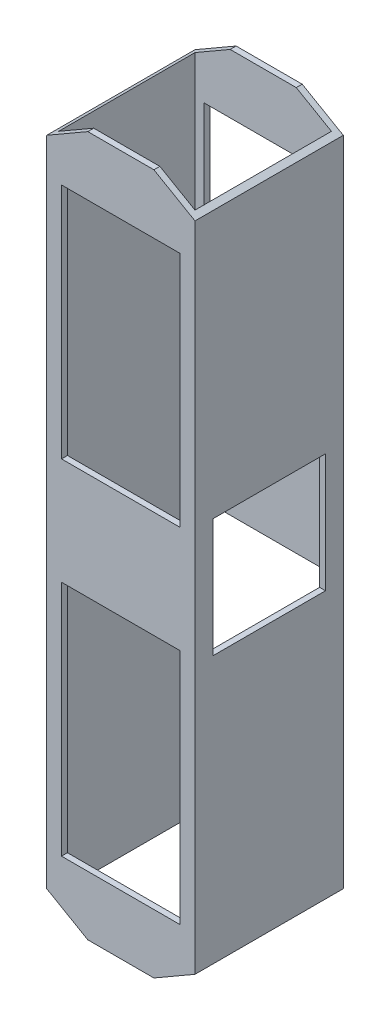
ISO-10303-21;
HEADER;
FILE_DESCRIPTION(('STEP AP214'),'2;1');
FILE_NAME('part.step','',(''),(''),'','','');
FILE_SCHEMA(('AUTOMOTIVE_DESIGN { 1 0 10303 214 1 1 1 1 }'));
ENDSEC;
DATA;
#1=APPLICATION_CONTEXT('core data for automotive mechanical design processes');
#2=APPLICATION_PROTOCOL_DEFINITION('international standard','automotive_design',2000,#1);
#3=PRODUCT_CONTEXT('',#1,'mechanical');
#4=PRODUCT('Part','Part','',(#3));
#5=PRODUCT_RELATED_PRODUCT_CATEGORY('part','',(#4));
#6=PRODUCT_DEFINITION_FORMATION('','',#4);
#7=PRODUCT_DEFINITION_CONTEXT('part definition',#1,'design');
#8=PRODUCT_DEFINITION('design','',#6,#7);
#9=PRODUCT_DEFINITION_SHAPE('','',#8);
#10=(LENGTH_UNIT() NAMED_UNIT(*) SI_UNIT(.MILLI.,.METRE.));
#11=(NAMED_UNIT(*) PLANE_ANGLE_UNIT() SI_UNIT($,.RADIAN.));
#12=(NAMED_UNIT(*) SI_UNIT($,.STERADIAN.) SOLID_ANGLE_UNIT());
#13=UNCERTAINTY_MEASURE_WITH_UNIT(LENGTH_MEASURE(1.E-05),#10,'distance_accuracy_value','');
#14=(GEOMETRIC_REPRESENTATION_CONTEXT(3) GLOBAL_UNCERTAINTY_ASSIGNED_CONTEXT((#13)) GLOBAL_UNIT_ASSIGNED_CONTEXT((#10,
#11,#12)) REPRESENTATION_CONTEXT('',''));
#15=CARTESIAN_POINT('',(0.,0.,0.));
#16=DIRECTION('',(0.,0.,1.));
#17=DIRECTION('',(1.,0.,0.));
#18=AXIS2_PLACEMENT_3D('',#15,#16,#17);
#19=CARTESIAN_POINT('',(-35.0558988321171,-98.8768142031625,25.));
#20=DIRECTION('',(0.,1.,0.));
#21=DIRECTION('',(0.,0.,1.));
#22=AXIS2_PLACEMENT_3D('',#19,#20,#21);
#23=PLANE('',#22);
#24=DIRECTION('',(1.,0.,0.));
#25=VECTOR('',#24,1.);
#26=CARTESIAN_POINT('',(-35.0558988321171,-98.8768142031625,0.));
#27=LINE('',#26,#25);
#28=CARTESIAN_POINT('',(-28.1276956018415,-98.8768142031625,0.));
#29=VERTEX_POINT('',#28);
#30=CARTESIAN_POINT('',(-16.9841020623928,-98.8768142031625,0.));
#31=VERTEX_POINT('',#30);
#32=EDGE_CURVE('E437',#29,#31,#27,.T.);
#33=ORIENTED_EDGE('',*,*,#32,.T.);
#34=DIRECTION('',(0.,0.,1.));
#35=VECTOR('',#34,1.);
#36=CARTESIAN_POINT('',(-16.9841020623928,-98.8768142031625,25.));
#37=LINE('',#36,#35);
#38=CARTESIAN_POINT('',(-16.9841020623927,-98.8768142031625,1.));
#39=VERTEX_POINT('',#38);
#40=EDGE_CURVE('E523',#31,#39,#37,.T.);
#41=ORIENTED_EDGE('',*,*,#40,.T.);
#42=DIRECTION('',(1.,0.,0.));
#43=VECTOR('',#42,1.);
#44=CARTESIAN_POINT('',(-35.0558988321171,-98.8768142031625,1.));
#45=LINE('',#44,#43);
#46=CARTESIAN_POINT('',(-28.1276956018414,-98.8768142031625,1.));
#47=VERTEX_POINT('',#46);
#48=EDGE_CURVE('E418',#47,#39,#45,.T.);
#49=ORIENTED_EDGE('',*,*,#48,.F.);
#50=DIRECTION('',(0.,0.,-1.));
#51=VECTOR('',#50,1.);
#52=CARTESIAN_POINT('',(-28.1276956018414,-98.8768142031625,25.));
#53=LINE('',#52,#51);
#54=EDGE_CURVE('E516',#47,#29,#53,.T.);
#55=ORIENTED_EDGE('',*,*,#54,.T.);
#56=EDGE_LOOP('',(#33,#41,#49,#55));
#57=FACE_BOUND('',#56,.T.);
#58=ADVANCED_FACE('F35',(#57),#23,.F.);
#59=CARTESIAN_POINT('',(-35.0558988321171,19.1231857968375,25.));
#60=DIRECTION('',(0.,-1.,0.));
#61=DIRECTION('',(0.,0.,-1.));
#62=AXIS2_PLACEMENT_3D('',#59,#60,#61);
#63=PLANE('',#62);
#64=DIRECTION('',(-1.,0.,0.));
#65=VECTOR('',#64,1.);
#66=CARTESIAN_POINT('',(-35.0558988321171,19.1231857968375,0.));
#67=LINE('',#66,#65);
#68=CARTESIAN_POINT('',(-16.9841020623928,19.1231857968375,0.));
#69=VERTEX_POINT('',#68);
#70=CARTESIAN_POINT('',(-28.1276956018415,19.1231857968375,0.));
#71=VERTEX_POINT('',#70);
#72=EDGE_CURVE('E447',#69,#71,#67,.T.);
#73=ORIENTED_EDGE('',*,*,#72,.T.);
#74=DIRECTION('',(0.,0.,1.));
#75=VECTOR('',#74,1.);
#76=CARTESIAN_POINT('',(-28.1276956018415,19.1231857968375,25.));
#77=LINE('',#76,#75);
#78=CARTESIAN_POINT('',(-28.1276956018415,19.1231857968375,1.));
#79=VERTEX_POINT('',#78);
#80=EDGE_CURVE('E486',#71,#79,#77,.T.);
#81=ORIENTED_EDGE('',*,*,#80,.T.);
#82=DIRECTION('',(-1.,0.,0.));
#83=VECTOR('',#82,1.);
#84=CARTESIAN_POINT('',(-35.0558988321171,19.1231857968375,1.));
#85=LINE('',#84,#83);
#86=CARTESIAN_POINT('',(-16.9841020623928,19.1231857968375,1.));
#87=VERTEX_POINT('',#86);
#88=EDGE_CURVE('E414',#87,#79,#85,.T.);
#89=ORIENTED_EDGE('',*,*,#88,.F.);
#90=DIRECTION('',(0.,0.,-1.));
#91=VECTOR('',#90,1.);
#92=CARTESIAN_POINT('',(-16.9841020623928,19.1231857968375,25.));
#93=LINE('',#92,#91);
#94=EDGE_CURVE('E479',#87,#69,#93,.T.);
#95=ORIENTED_EDGE('',*,*,#94,.T.);
#96=EDGE_LOOP('',(#73,#81,#89,#95));
#97=FACE_BOUND('',#96,.T.);
#98=ADVANCED_FACE('F588',(#97),#63,.F.);
#99=DIRECTION('',(-1.,0.,0.));
#100=VECTOR('',#99,1.);
#101=CARTESIAN_POINT('',(-35.0558988321171,19.1231857968375,24.));
#102=LINE('',#101,#100);
#103=CARTESIAN_POINT('',(-16.9841020623928,19.1231857968375,24.));
#104=VERTEX_POINT('',#103);
#105=CARTESIAN_POINT('',(-28.1276956018415,19.1231857968375,24.));
#106=VERTEX_POINT('',#105);
#107=EDGE_CURVE('E417',#104,#106,#102,.T.);
#108=ORIENTED_EDGE('',*,*,#107,.T.);
#109=DIRECTION('',(0.,0.,1.));
#110=VECTOR('',#109,1.);
#111=CARTESIAN_POINT('',(-28.1276956018415,19.1231857968375,25.));
#112=LINE('',#111,#110);
#113=CARTESIAN_POINT('',(-28.1276956018415,19.1231857968375,25.));
#114=VERTEX_POINT('',#113);
#115=EDGE_CURVE('E484',#106,#114,#112,.T.);
#116=ORIENTED_EDGE('',*,*,#115,.T.);
#117=DIRECTION('',(-1.,0.,0.));
#118=VECTOR('',#117,1.);
#119=CARTESIAN_POINT('',(-35.0558988321171,19.1231857968375,25.));
#120=LINE('',#119,#118);
#121=CARTESIAN_POINT('',(-16.9841020623928,19.1231857968375,25.));
#122=VERTEX_POINT('',#121);
#123=EDGE_CURVE('E436',#122,#114,#120,.T.);
#124=ORIENTED_EDGE('',*,*,#123,.F.);
#125=DIRECTION('',(0.,0.,-1.));
#126=VECTOR('',#125,1.);
#127=CARTESIAN_POINT('',(-16.9841020623928,19.1231857968375,25.));
#128=LINE('',#127,#126);
#129=EDGE_CURVE('E481',#122,#104,#128,.T.);
#130=ORIENTED_EDGE('',*,*,#129,.T.);
#131=EDGE_LOOP('',(#108,#116,#124,#130));
#132=FACE_BOUND('',#131,.T.);
#133=ADVANCED_FACE('F599',(#132),#63,.F.);
#134=DIRECTION('',(1.,0.,0.));
#135=VECTOR('',#134,1.);
#136=CARTESIAN_POINT('',(-35.0558988321171,-98.8768142031625,24.));
#137=LINE('',#136,#135);
#138=CARTESIAN_POINT('',(-28.1276956018415,-98.8768142031625,24.));
#139=VERTEX_POINT('',#138);
#140=CARTESIAN_POINT('',(-16.9841020623928,-98.8768142031625,24.));
#141=VERTEX_POINT('',#140);
#142=EDGE_CURVE('E421',#139,#141,#137,.T.);
#143=ORIENTED_EDGE('',*,*,#142,.T.);
#144=DIRECTION('',(0.,0.,1.));
#145=VECTOR('',#144,1.);
#146=CARTESIAN_POINT('',(-16.9841020623928,-98.8768142031625,25.));
#147=LINE('',#146,#145);
#148=CARTESIAN_POINT('',(-16.9841020623928,-98.8768142031625,25.));
#149=VERTEX_POINT('',#148);
#150=EDGE_CURVE('E521',#141,#149,#147,.T.);
#151=ORIENTED_EDGE('',*,*,#150,.T.);
#152=DIRECTION('',(1.,0.,0.));
#153=VECTOR('',#152,1.);
#154=CARTESIAN_POINT('',(-35.0558988321171,-98.8768142031625,25.));
#155=LINE('',#154,#153);
#156=CARTESIAN_POINT('',(-28.1276956018414,-98.8768142031625,25.));
#157=VERTEX_POINT('',#156);
#158=EDGE_CURVE('E442',#157,#149,#155,.T.);
#159=ORIENTED_EDGE('',*,*,#158,.F.);
#160=DIRECTION('',(0.,0.,-1.));
#161=VECTOR('',#160,1.);
#162=CARTESIAN_POINT('',(-28.1276956018414,-98.8768142031625,25.));
#163=LINE('',#162,#161);
#164=EDGE_CURVE('E518',#157,#139,#163,.T.);
#165=ORIENTED_EDGE('',*,*,#164,.T.);
#166=EDGE_LOOP('',(#143,#151,#159,#165));
#167=FACE_BOUND('',#166,.T.);
#168=ADVANCED_FACE('F576',(#167),#23,.F.);
#169=CARTESIAN_POINT('',(-10.0558988321171,19.1231857968375,25.));
#170=DIRECTION('',(-1.,0.,0.));
#171=DIRECTION('',(0.,-1.,0.));
#172=AXIS2_PLACEMENT_3D('',#169,#170,#171);
#173=PLANE('',#172);
#174=DIRECTION('',(0.,1.,0.));
#175=VECTOR('',#174,1.);
#176=CARTESIAN_POINT('',(-10.0558988321171,-29.8768142031625,3.));
#177=LINE('',#176,#175);
#178=CARTESIAN_POINT('',(-10.0558988321171,-49.8768142031625,3.));
#179=VERTEX_POINT('',#178);
#180=CARTESIAN_POINT('',(-10.0558988321171,-29.8768142031625,3.));
#181=VERTEX_POINT('',#180);
#182=EDGE_CURVE('E303',#179,#181,#177,.T.);
#183=ORIENTED_EDGE('',*,*,#182,.F.);
#184=DIRECTION('',(0.,0.,-1.));
#185=VECTOR('',#184,1.);
#186=CARTESIAN_POINT('',(-10.0558988321171,-49.8768142031625,3.));
#187=LINE('',#186,#185);
#188=CARTESIAN_POINT('',(-10.0558988321171,-49.8768142031625,22.));
#189=VERTEX_POINT('',#188);
#190=EDGE_CURVE('E276',#189,#179,#187,.T.);
#191=ORIENTED_EDGE('',*,*,#190,.F.);
#192=DIRECTION('',(0.,-1.,0.));
#193=VECTOR('',#192,1.);
#194=CARTESIAN_POINT('',(-10.0558988321171,-29.8768142031625,22.));
#195=LINE('',#194,#193);
#196=CARTESIAN_POINT('',(-10.0558988321171,-29.8768142031625,22.));
#197=VERTEX_POINT('',#196);
#198=EDGE_CURVE('E294',#197,#189,#195,.T.);
#199=ORIENTED_EDGE('',*,*,#198,.F.);
#200=DIRECTION('',(0.,0.,1.));
#201=VECTOR('',#200,1.);
#202=CARTESIAN_POINT('',(-10.0558988321171,-29.8768142031625,3.));
#203=LINE('',#202,#201);
#204=EDGE_CURVE('E297',#181,#197,#203,.T.);
#205=ORIENTED_EDGE('',*,*,#204,.F.);
#206=EDGE_LOOP('',(#183,#191,#199,#205));
#207=FACE_BOUND('',#206,.T.);
#208=DIRECTION('',(0.,1.,0.));
#209=VECTOR('',#208,1.);
#210=CARTESIAN_POINT('',(-10.0558988321171,19.1231857968375,25.));
#211=LINE('',#210,#209);
#212=CARTESIAN_POINT('',(-10.0558988321171,-94.8768142031624,25.));
#213=VERTEX_POINT('',#212);
#214=CARTESIAN_POINT('',(-10.0558988321171,15.1231857968374,25.));
#215=VERTEX_POINT('',#214);
#216=EDGE_CURVE('E434',#213,#215,#211,.T.);
#217=ORIENTED_EDGE('',*,*,#216,.F.);
#218=DIRECTION('',(0.,0.,-1.));
#219=VECTOR('',#218,1.);
#220=CARTESIAN_POINT('',(-10.0558988321171,-94.8768142031625,25.));
#221=LINE('',#220,#219);
#222=CARTESIAN_POINT('',(-10.0558988321171,-94.8768142031625,0.));
#223=VERTEX_POINT('',#222);
#224=EDGE_CURVE('E509',#213,#223,#221,.T.);
#225=ORIENTED_EDGE('',*,*,#224,.T.);
#226=DIRECTION('',(0.,1.,0.));
#227=VECTOR('',#226,1.);
#228=CARTESIAN_POINT('',(-10.0558988321171,19.1231857968375,0.));
#229=LINE('',#228,#227);
#230=CARTESIAN_POINT('',(-10.0558988321171,15.1231857968374,0.));
#231=VERTEX_POINT('',#230);
#232=EDGE_CURVE('E431',#223,#231,#229,.T.);
#233=ORIENTED_EDGE('',*,*,#232,.T.);
#234=DIRECTION('',(0.,0.,1.));
#235=VECTOR('',#234,1.);
#236=CARTESIAN_POINT('',(-10.0558988321171,15.1231857968374,25.));
#237=LINE('',#236,#235);
#238=EDGE_CURVE('E506',#231,#215,#237,.T.);
#239=ORIENTED_EDGE('',*,*,#238,.T.);
#240=EDGE_LOOP('',(#217,#225,#233,#239));
#241=FACE_BOUND('',#240,.T.);
#242=ADVANCED_FACE('F565',(#207,#241),#173,.F.);
#243=CARTESIAN_POINT('',(-35.0558988321171,-98.8768142031625,25.));
#244=DIRECTION('',(1.,0.,0.));
#245=DIRECTION('',(0.,1.,0.));
#246=AXIS2_PLACEMENT_3D('',#243,#244,#245);
#247=PLANE('',#246);
#248=DIRECTION('',(0.,-1.,0.));
#249=VECTOR('',#248,1.);
#250=CARTESIAN_POINT('',(-35.0558988321171,-98.8768142031625,0.));
#251=LINE('',#250,#249);
#252=CARTESIAN_POINT('',(-35.0558988321171,15.1231857968374,0.));
#253=VERTEX_POINT('',#252);
#254=CARTESIAN_POINT('',(-35.0558988321171,-94.8768142031625,0.));
#255=VERTEX_POINT('',#254);
#256=EDGE_CURVE('E450',#253,#255,#251,.T.);
#257=ORIENTED_EDGE('',*,*,#256,.T.);
#258=DIRECTION('',(0.,0.,1.));
#259=VECTOR('',#258,1.);
#260=CARTESIAN_POINT('',(-35.0558988321171,-94.8768142031625,25.));
#261=LINE('',#260,#259);
#262=CARTESIAN_POINT('',(-35.0558988321171,-94.8768142031625,25.));
#263=VERTEX_POINT('',#262);
#264=EDGE_CURVE('E11',#255,#263,#261,.T.);
#265=ORIENTED_EDGE('',*,*,#264,.T.);
#266=DIRECTION('',(0.,-1.,0.));
#267=VECTOR('',#266,1.);
#268=CARTESIAN_POINT('',(-35.0558988321171,-98.8768142031625,25.));
#269=LINE('',#268,#267);
#270=CARTESIAN_POINT('',(-35.0558988321171,15.1231857968374,25.));
#271=VERTEX_POINT('',#270);
#272=EDGE_CURVE('E440',#271,#263,#269,.T.);
#273=ORIENTED_EDGE('',*,*,#272,.F.);
#274=DIRECTION('',(0.,0.,-1.));
#275=VECTOR('',#274,1.);
#276=CARTESIAN_POINT('',(-35.0558988321171,15.1231857968374,25.));
#277=LINE('',#276,#275);
#278=EDGE_CURVE('E471',#271,#253,#277,.T.);
#279=ORIENTED_EDGE('',*,*,#278,.T.);
#280=EDGE_LOOP('',(#257,#265,#273,#279));
#281=FACE_BOUND('',#280,.T.);
#282=ADVANCED_FACE('F602',(#281),#247,.F.);
#283=CARTESIAN_POINT('',(0.,0.,25.));
#284=DIRECTION('',(0.,0.,1.));
#285=DIRECTION('',(1.,0.,0.));
#286=AXIS2_PLACEMENT_3D('',#283,#284,#285);
#287=PLANE('',#286);
#288=DIRECTION('',(-1.,0.,0.));
#289=VECTOR('',#288,1.);
#290=CARTESIAN_POINT('',(-12.5558988321171,-48.8768142031625,25.));
#291=LINE('',#290,#289);
#292=CARTESIAN_POINT('',(-12.5558988321171,-48.8768142031625,25.));
#293=VERTEX_POINT('',#292);
#294=CARTESIAN_POINT('',(-32.5558988321171,-48.8768142031625,25.));
#295=VERTEX_POINT('',#294);
#296=EDGE_CURVE('E309',#293,#295,#291,.T.);
#297=ORIENTED_EDGE('',*,*,#296,.F.);
#298=DIRECTION('',(0.,1.,0.));
#299=VECTOR('',#298,1.);
#300=CARTESIAN_POINT('',(-12.5558988321171,-88.8768142031625,25.));
#301=LINE('',#300,#299);
#302=CARTESIAN_POINT('',(-12.5558988321171,-88.8768142031625,25.));
#303=VERTEX_POINT('',#302);
#304=EDGE_CURVE('E317',#303,#293,#301,.T.);
#305=ORIENTED_EDGE('',*,*,#304,.F.);
#306=DIRECTION('',(1.,0.,0.));
#307=VECTOR('',#306,1.);
#308=CARTESIAN_POINT('',(-22.5558988321171,-88.8768142031625,25.));
#309=LINE('',#308,#307);
#310=CARTESIAN_POINT('',(-32.5558988321171,-88.8768142031625,25.));
#311=VERTEX_POINT('',#310);
#312=EDGE_CURVE('E331',#311,#303,#309,.T.);
#313=ORIENTED_EDGE('',*,*,#312,.F.);
#314=DIRECTION('',(0.,-1.,0.));
#315=VECTOR('',#314,1.);
#316=CARTESIAN_POINT('',(-32.5558988321171,-48.8768142031625,25.));
#317=LINE('',#316,#315);
#318=EDGE_CURVE('E328',#295,#311,#317,.T.);
#319=ORIENTED_EDGE('',*,*,#318,.F.);
#320=EDGE_LOOP('',(#297,#305,#313,#319));
#321=FACE_BOUND('',#320,.T.);
#322=DIRECTION('',(-1.,0.,0.));
#323=VECTOR('',#322,1.);
#324=CARTESIAN_POINT('',(-22.5558988321171,9.12318579683749,25.));
#325=LINE('',#324,#323);
#326=CARTESIAN_POINT('',(-12.5558988321171,9.12318579683749,25.));
#327=VERTEX_POINT('',#326);
#328=CARTESIAN_POINT('',(-32.5558988321171,9.12318579683748,25.));
#329=VERTEX_POINT('',#328);
#330=EDGE_CURVE('E367',#327,#329,#325,.T.);
#331=ORIENTED_EDGE('',*,*,#330,.F.);
#332=DIRECTION('',(0.,1.,0.));
#333=VECTOR('',#332,1.);
#334=CARTESIAN_POINT('',(-12.5558988321171,9.12318579683749,25.));
#335=LINE('',#334,#333);
#336=CARTESIAN_POINT('',(-12.5558988321171,-30.8768142031625,25.));
#337=VERTEX_POINT('',#336);
#338=EDGE_CURVE('E382',#337,#327,#335,.T.);
#339=ORIENTED_EDGE('',*,*,#338,.F.);
#340=DIRECTION('',(1.,0.,0.));
#341=VECTOR('',#340,1.);
#342=CARTESIAN_POINT('',(-12.5558988321171,-30.8768142031625,25.));
#343=LINE('',#342,#341);
#344=CARTESIAN_POINT('',(-32.5558988321171,-30.8768142031625,25.));
#345=VERTEX_POINT('',#344);
#346=EDGE_CURVE('E379',#345,#337,#343,.T.);
#347=ORIENTED_EDGE('',*,*,#346,.F.);
#348=DIRECTION('',(0.,-1.,0.));
#349=VECTOR('',#348,1.);
#350=CARTESIAN_POINT('',(-32.5558988321171,-30.8768142031625,25.));
#351=LINE('',#350,#349);
#352=EDGE_CURVE('E362',#329,#345,#351,.T.);
#353=ORIENTED_EDGE('',*,*,#352,.F.);
#354=EDGE_LOOP('',(#331,#339,#347,#353));
#355=FACE_BOUND('',#354,.T.);
#356=ORIENTED_EDGE('',*,*,#158,.T.);
#357=DIRECTION('',(-0.866025403784441,-0.499999999999996,0.));
#358=VECTOR('',#357,1.);
#359=CARTESIAN_POINT('',(38.568890957008,-66.8032787291224,25.));
#360=LINE('',#359,#358);
#361=EDGE_CURVE('E536',#149,#213,#360,.F.);
#362=ORIENTED_EDGE('',*,*,#361,.T.);
#363=ORIENTED_EDGE('',*,*,#216,.T.);
#364=DIRECTION('',(0.866025403784441,-0.499999999999996,0.));
#365=VECTOR('',#364,1.);
#366=CARTESIAN_POINT('',(4.03455683507734,6.98805742437831,25.));
#367=LINE('',#366,#365);
#368=EDGE_CURVE('E499',#215,#122,#367,.F.);
#369=ORIENTED_EDGE('',*,*,#368,.T.);
#370=ORIENTED_EDGE('',*,*,#123,.T.);
#371=DIRECTION('',(0.866025403784441,0.499999999999996,0.));
#372=VECTOR('',#371,1.);
#373=CARTESIAN_POINT('',(-15.3125062511357,26.5220388181834,25.));
#374=LINE('',#373,#372);
#375=EDGE_CURVE('E501',#114,#271,#374,.F.);
#376=ORIENTED_EDGE('',*,*,#375,.T.);
#377=ORIENTED_EDGE('',*,*,#272,.T.);
#378=DIRECTION('',(-0.866025403784441,0.499999999999996,0.));
#379=VECTOR('',#378,1.);
#380=CARTESIAN_POINT('',(-49.8468403730664,-86.3372601229275,25.));
#381=LINE('',#380,#379);
#382=EDGE_CURVE('E534',#263,#157,#381,.F.);
#383=ORIENTED_EDGE('',*,*,#382,.T.);
#384=EDGE_LOOP('',(#356,#362,#363,#369,#370,#376,#377,#383));
#385=FACE_BOUND('',#384,.T.);
#386=ADVANCED_FACE('F569',(#321,#355,#385),#287,.T.);
#387=CARTESIAN_POINT('',(0.,0.,0.));
#388=DIRECTION('',(0.,0.,1.));
#389=DIRECTION('',(1.,0.,0.));
#390=AXIS2_PLACEMENT_3D('',#387,#388,#389);
#391=PLANE('',#390);
#392=DIRECTION('',(0.,1.,0.));
#393=VECTOR('',#392,1.);
#394=CARTESIAN_POINT('',(-12.5558988321171,-88.8768142031625,0.));
#395=LINE('',#394,#393);
#396=CARTESIAN_POINT('',(-12.5558988321171,-88.8768142031625,0.));
#397=VERTEX_POINT('',#396);
#398=CARTESIAN_POINT('',(-12.5558988321171,-48.8768142031625,0.));
#399=VERTEX_POINT('',#398);
#400=EDGE_CURVE('E323',#397,#399,#395,.T.);
#401=ORIENTED_EDGE('',*,*,#400,.T.);
#402=DIRECTION('',(-1.,0.,0.));
#403=VECTOR('',#402,1.);
#404=CARTESIAN_POINT('',(-12.5558988321171,-48.8768142031625,0.));
#405=LINE('',#404,#403);
#406=CARTESIAN_POINT('',(-32.5558988321171,-48.8768142031625,0.));
#407=VERTEX_POINT('',#406);
#408=EDGE_CURVE('E313',#399,#407,#405,.T.);
#409=ORIENTED_EDGE('',*,*,#408,.T.);
#410=DIRECTION('',(0.,-1.,0.));
#411=VECTOR('',#410,1.);
#412=CARTESIAN_POINT('',(-32.5558988321171,-48.8768142031625,0.));
#413=LINE('',#412,#411);
#414=CARTESIAN_POINT('',(-32.5558988321171,-88.8768142031625,0.));
#415=VERTEX_POINT('',#414);
#416=EDGE_CURVE('E316',#407,#415,#413,.T.);
#417=ORIENTED_EDGE('',*,*,#416,.T.);
#418=DIRECTION('',(1.,0.,0.));
#419=VECTOR('',#418,1.);
#420=CARTESIAN_POINT('',(-32.5558988321171,-88.8768142031625,0.));
#421=LINE('',#420,#419);
#422=EDGE_CURVE('E320',#415,#397,#421,.T.);
#423=ORIENTED_EDGE('',*,*,#422,.T.);
#424=EDGE_LOOP('',(#401,#409,#417,#423));
#425=FACE_BOUND('',#424,.T.);
#426=DIRECTION('',(0.,1.,0.));
#427=VECTOR('',#426,1.);
#428=CARTESIAN_POINT('',(-12.5558988321171,9.12318579683749,0.));
#429=LINE('',#428,#427);
#430=CARTESIAN_POINT('',(-12.5558988321171,-30.8768142031625,0.));
#431=VERTEX_POINT('',#430);
#432=CARTESIAN_POINT('',(-12.5558988321171,9.12318579683749,0.));
#433=VERTEX_POINT('',#432);
#434=EDGE_CURVE('E373',#431,#433,#429,.T.);
#435=ORIENTED_EDGE('',*,*,#434,.T.);
#436=DIRECTION('',(-1.,0.,0.));
#437=VECTOR('',#436,1.);
#438=CARTESIAN_POINT('',(-22.5558988321171,9.12318579683749,0.));
#439=LINE('',#438,#437);
#440=CARTESIAN_POINT('',(-32.5558988321171,9.12318579683748,0.));
#441=VERTEX_POINT('',#440);
#442=EDGE_CURVE('E363',#433,#441,#439,.T.);
#443=ORIENTED_EDGE('',*,*,#442,.T.);
#444=DIRECTION('',(0.,-1.,0.));
#445=VECTOR('',#444,1.);
#446=CARTESIAN_POINT('',(-32.5558988321171,-30.8768142031625,0.));
#447=LINE('',#446,#445);
#448=CARTESIAN_POINT('',(-32.5558988321171,-30.8768142031625,0.));
#449=VERTEX_POINT('',#448);
#450=EDGE_CURVE('E366',#441,#449,#447,.T.);
#451=ORIENTED_EDGE('',*,*,#450,.T.);
#452=DIRECTION('',(1.,0.,0.));
#453=VECTOR('',#452,1.);
#454=CARTESIAN_POINT('',(-12.5558988321171,-30.8768142031625,0.));
#455=LINE('',#454,#453);
#456=EDGE_CURVE('E370',#449,#431,#455,.T.);
#457=ORIENTED_EDGE('',*,*,#456,.T.);
#458=EDGE_LOOP('',(#435,#443,#451,#457));
#459=FACE_BOUND('',#458,.T.);
#460=ORIENTED_EDGE('',*,*,#232,.F.);
#461=DIRECTION('',(0.866025403784441,0.499999999999996,0.));
#462=VECTOR('',#461,1.);
#463=CARTESIAN_POINT('',(-10.0558988321171,-94.8768142031625,0.));
#464=LINE('',#463,#462);
#465=EDGE_CURVE('E514',#223,#31,#464,.F.);
#466=ORIENTED_EDGE('',*,*,#465,.T.);
#467=ORIENTED_EDGE('',*,*,#32,.F.);
#468=DIRECTION('',(0.866025403784441,-0.499999999999996,0.));
#469=VECTOR('',#468,1.);
#470=CARTESIAN_POINT('',(-28.1276956018414,-98.8768142031625,0.));
#471=LINE('',#470,#469);
#472=EDGE_CURVE('E512',#29,#255,#471,.F.);
#473=ORIENTED_EDGE('',*,*,#472,.T.);
#474=ORIENTED_EDGE('',*,*,#256,.F.);
#475=DIRECTION('',(-0.866025403784441,-0.499999999999996,0.));
#476=VECTOR('',#475,1.);
#477=CARTESIAN_POINT('',(-35.0558988321171,15.1231857968374,0.));
#478=LINE('',#477,#476);
#479=EDGE_CURVE('E477',#253,#71,#478,.F.);
#480=ORIENTED_EDGE('',*,*,#479,.T.);
#481=ORIENTED_EDGE('',*,*,#72,.F.);
#482=DIRECTION('',(-0.866025403784441,0.499999999999996,0.));
#483=VECTOR('',#482,1.);
#484=CARTESIAN_POINT('',(-16.9841020623928,19.1231857968375,0.));
#485=LINE('',#484,#483);
#486=EDGE_CURVE('E474',#69,#231,#485,.F.);
#487=ORIENTED_EDGE('',*,*,#486,.T.);
#488=EDGE_LOOP('',(#460,#466,#467,#473,#474,#480,#481,#487));
#489=FACE_BOUND('',#488,.T.);
#490=ADVANCED_FACE('F556',(#425,#459,#489),#391,.F.);
#491=CARTESIAN_POINT('',(-11.0558988321171,19.1231857968375,25.));
#492=DIRECTION('',(-1.,0.,0.));
#493=DIRECTION('',(0.,-1.,0.));
#494=AXIS2_PLACEMENT_3D('',#491,#492,#493);
#495=PLANE('',#494);
#496=DIRECTION('',(0.,0.,-1.));
#497=VECTOR('',#496,1.);
#498=CARTESIAN_POINT('',(-11.0558988321171,-49.8768142031625,3.));
#499=LINE('',#498,#497);
#500=CARTESIAN_POINT('',(-11.0558988321171,-49.8768142031625,22.));
#501=VERTEX_POINT('',#500);
#502=CARTESIAN_POINT('',(-11.0558988321171,-49.8768142031625,3.));
#503=VERTEX_POINT('',#502);
#504=EDGE_CURVE('E273',#501,#503,#499,.T.);
#505=ORIENTED_EDGE('',*,*,#504,.T.);
#506=DIRECTION('',(0.,1.,0.));
#507=VECTOR('',#506,1.);
#508=CARTESIAN_POINT('',(-11.0558988321171,-29.8768142031625,3.));
#509=LINE('',#508,#507);
#510=CARTESIAN_POINT('',(-11.0558988321171,-29.8768142031625,3.));
#511=VERTEX_POINT('',#510);
#512=EDGE_CURVE('E285',#503,#511,#509,.T.);
#513=ORIENTED_EDGE('',*,*,#512,.T.);
#514=DIRECTION('',(0.,0.,1.));
#515=VECTOR('',#514,1.);
#516=CARTESIAN_POINT('',(-11.0558988321171,-29.8768142031625,3.));
#517=LINE('',#516,#515);
#518=CARTESIAN_POINT('',(-11.0558988321171,-29.8768142031625,22.));
#519=VERTEX_POINT('',#518);
#520=EDGE_CURVE('E289',#511,#519,#517,.T.);
#521=ORIENTED_EDGE('',*,*,#520,.T.);
#522=DIRECTION('',(0.,-1.,0.));
#523=VECTOR('',#522,1.);
#524=CARTESIAN_POINT('',(-11.0558988321171,-29.8768142031625,22.));
#525=LINE('',#524,#523);
#526=EDGE_CURVE('E281',#519,#501,#525,.T.);
#527=ORIENTED_EDGE('',*,*,#526,.T.);
#528=EDGE_LOOP('',(#505,#513,#521,#527));
#529=FACE_BOUND('',#528,.T.);
#530=DIRECTION('',(0.,1.,0.));
#531=VECTOR('',#530,1.);
#532=CARTESIAN_POINT('',(-11.0558988321171,19.1231857968375,1.));
#533=LINE('',#532,#531);
#534=CARTESIAN_POINT('',(-11.0558988321171,-95.4541644723521,1.));
#535=VERTEX_POINT('',#534);
#536=CARTESIAN_POINT('',(-11.0558988321171,15.7005360660271,1.));
#537=VERTEX_POINT('',#536);
#538=EDGE_CURVE('E412',#535,#537,#533,.T.);
#539=ORIENTED_EDGE('',*,*,#538,.F.);
#540=DIRECTION('',(0.,0.,-1.));
#541=VECTOR('',#540,1.);
#542=CARTESIAN_POINT('',(-11.0558988321171,-95.4541644723521,25.));
#543=LINE('',#542,#541);
#544=CARTESIAN_POINT('',(-11.0558988321171,-95.4541644723521,24.));
#545=VERTEX_POINT('',#544);
#546=EDGE_CURVE('E529',#535,#545,#543,.F.);
#547=ORIENTED_EDGE('',*,*,#546,.T.);
#548=DIRECTION('',(0.,1.,0.));
#549=VECTOR('',#548,1.);
#550=CARTESIAN_POINT('',(-11.0558988321171,19.1231857968375,24.));
#551=LINE('',#550,#549);
#552=CARTESIAN_POINT('',(-11.0558988321171,15.7005360660271,24.));
#553=VERTEX_POINT('',#552);
#554=EDGE_CURVE('E415',#545,#553,#551,.T.);
#555=ORIENTED_EDGE('',*,*,#554,.T.);
#556=DIRECTION('',(0.,0.,1.));
#557=VECTOR('',#556,1.);
#558=CARTESIAN_POINT('',(-11.0558988321171,15.7005360660271,25.));
#559=LINE('',#558,#557);
#560=EDGE_CURVE('E503',#553,#537,#559,.F.);
#561=ORIENTED_EDGE('',*,*,#560,.T.);
#562=EDGE_LOOP('',(#539,#547,#555,#561));
#563=FACE_BOUND('',#562,.T.);
#564=ADVANCED_FACE('F291',(#529,#563),#495,.T.);
#565=CARTESIAN_POINT('',(-34.0558988321171,-98.8768142031625,25.));
#566=DIRECTION('',(1.,0.,0.));
#567=DIRECTION('',(0.,1.,0.));
#568=AXIS2_PLACEMENT_3D('',#565,#566,#567);
#569=PLANE('',#568);
#570=DIRECTION('',(0.,-1.,0.));
#571=VECTOR('',#570,1.);
#572=CARTESIAN_POINT('',(-34.0558988321171,-98.8768142031625,24.));
#573=LINE('',#572,#571);
#574=CARTESIAN_POINT('',(-34.0558988321171,15.7005360660271,24.));
#575=VERTEX_POINT('',#574);
#576=CARTESIAN_POINT('',(-34.0558988321171,-95.4541644723521,24.));
#577=VERTEX_POINT('',#576);
#578=EDGE_CURVE('E419',#575,#577,#573,.T.);
#579=ORIENTED_EDGE('',*,*,#578,.T.);
#580=DIRECTION('',(0.,0.,1.));
#581=VECTOR('',#580,1.);
#582=CARTESIAN_POINT('',(-34.0558988321171,-95.4541644723521,25.));
#583=LINE('',#582,#581);
#584=CARTESIAN_POINT('',(-34.0558988321171,-95.4541644723521,1.));
#585=VERTEX_POINT('',#584);
#586=EDGE_CURVE('E43',#577,#585,#583,.F.);
#587=ORIENTED_EDGE('',*,*,#586,.T.);
#588=DIRECTION('',(0.,-1.,0.));
#589=VECTOR('',#588,1.);
#590=CARTESIAN_POINT('',(-34.0558988321171,-98.8768142031625,1.));
#591=LINE('',#590,#589);
#592=CARTESIAN_POINT('',(-34.0558988321171,15.700536066027,1.));
#593=VERTEX_POINT('',#592);
#594=EDGE_CURVE('E422',#593,#585,#591,.T.);
#595=ORIENTED_EDGE('',*,*,#594,.F.);
#596=DIRECTION('',(0.,0.,-1.));
#597=VECTOR('',#596,1.);
#598=CARTESIAN_POINT('',(-34.0558988321171,15.700536066027,25.));
#599=LINE('',#598,#597);
#600=EDGE_CURVE('E492',#593,#575,#599,.F.);
#601=ORIENTED_EDGE('',*,*,#600,.T.);
#602=EDGE_LOOP('',(#579,#587,#595,#601));
#603=FACE_BOUND('',#602,.T.);
#604=ADVANCED_FACE('F540',(#603),#569,.T.);
#605=CARTESIAN_POINT('',(0.,0.,24.));
#606=DIRECTION('',(0.,0.,1.));
#607=DIRECTION('',(1.,0.,0.));
#608=AXIS2_PLACEMENT_3D('',#605,#606,#607);
#609=PLANE('',#608);
#610=DIRECTION('',(0.,1.,0.));
#611=VECTOR('',#610,1.);
#612=CARTESIAN_POINT('',(-12.5558988321171,0.,24.));
#613=LINE('',#612,#611);
#614=CARTESIAN_POINT('',(-12.5558988321171,-88.8768142031625,24.));
#615=VERTEX_POINT('',#614);
#616=CARTESIAN_POINT('',(-12.5558988321171,-48.8768142031625,24.));
#617=VERTEX_POINT('',#616);
#618=EDGE_CURVE('E356',#615,#617,#613,.T.);
#619=ORIENTED_EDGE('',*,*,#618,.T.);
#620=DIRECTION('',(-1.,0.,0.));
#621=VECTOR('',#620,1.);
#622=CARTESIAN_POINT('',(0.,-48.8768142031625,24.));
#623=LINE('',#622,#621);
#624=CARTESIAN_POINT('',(-32.5558988321171,-48.8768142031625,24.));
#625=VERTEX_POINT('',#624);
#626=EDGE_CURVE('E359',#617,#625,#623,.T.);
#627=ORIENTED_EDGE('',*,*,#626,.T.);
#628=DIRECTION('',(0.,-1.,0.));
#629=VECTOR('',#628,1.);
#630=CARTESIAN_POINT('',(-32.5558988321171,0.,24.));
#631=LINE('',#630,#629);
#632=CARTESIAN_POINT('',(-32.5558988321171,-88.8768142031625,24.));
#633=VERTEX_POINT('',#632);
#634=EDGE_CURVE('E339',#625,#633,#631,.T.);
#635=ORIENTED_EDGE('',*,*,#634,.T.);
#636=DIRECTION('',(1.,0.,0.));
#637=VECTOR('',#636,1.);
#638=CARTESIAN_POINT('',(0.,-88.8768142031625,24.));
#639=LINE('',#638,#637);
#640=EDGE_CURVE('E353',#633,#615,#639,.T.);
#641=ORIENTED_EDGE('',*,*,#640,.T.);
#642=EDGE_LOOP('',(#619,#627,#635,#641));
#643=FACE_BOUND('',#642,.T.);
#644=DIRECTION('',(0.,1.,0.));
#645=VECTOR('',#644,1.);
#646=CARTESIAN_POINT('',(-12.5558988321171,0.,24.));
#647=LINE('',#646,#645);
#648=CARTESIAN_POINT('',(-12.5558988321171,-30.8768142031625,24.));
#649=VERTEX_POINT('',#648);
#650=CARTESIAN_POINT('',(-12.5558988321171,9.12318579683749,24.));
#651=VERTEX_POINT('',#650);
#652=EDGE_CURVE('E406',#649,#651,#647,.T.);
#653=ORIENTED_EDGE('',*,*,#652,.T.);
#654=DIRECTION('',(-1.,0.,0.));
#655=VECTOR('',#654,1.);
#656=CARTESIAN_POINT('',(0.,9.12318579683749,24.));
#657=LINE('',#656,#655);
#658=CARTESIAN_POINT('',(-32.5558988321171,9.12318579683748,24.));
#659=VERTEX_POINT('',#658);
#660=EDGE_CURVE('E409',#651,#659,#657,.T.);
#661=ORIENTED_EDGE('',*,*,#660,.T.);
#662=DIRECTION('',(0.,-1.,0.));
#663=VECTOR('',#662,1.);
#664=CARTESIAN_POINT('',(-32.5558988321171,0.,24.));
#665=LINE('',#664,#663);
#666=CARTESIAN_POINT('',(-32.5558988321171,-30.8768142031625,24.));
#667=VERTEX_POINT('',#666);
#668=EDGE_CURVE('E389',#659,#667,#665,.T.);
#669=ORIENTED_EDGE('',*,*,#668,.T.);
#670=DIRECTION('',(1.,0.,0.));
#671=VECTOR('',#670,1.);
#672=CARTESIAN_POINT('',(0.,-30.8768142031625,24.));
#673=LINE('',#672,#671);
#674=EDGE_CURVE('E403',#667,#649,#673,.T.);
#675=ORIENTED_EDGE('',*,*,#674,.T.);
#676=EDGE_LOOP('',(#653,#661,#669,#675));
#677=FACE_BOUND('',#676,.T.);
#678=ORIENTED_EDGE('',*,*,#554,.F.);
#679=DIRECTION('',(0.866025403784441,0.499999999999996,0.));
#680=VECTOR('',#679,1.);
#681=CARTESIAN_POINT('',(-10.0558988321171,-94.8768142031625,24.));
#682=LINE('',#681,#680);
#683=EDGE_CURVE('E532',#545,#141,#682,.F.);
#684=ORIENTED_EDGE('',*,*,#683,.T.);
#685=ORIENTED_EDGE('',*,*,#142,.F.);
#686=DIRECTION('',(0.866025403784441,-0.499999999999996,0.));
#687=VECTOR('',#686,1.);
#688=CARTESIAN_POINT('',(-28.1276956018414,-98.8768142031625,24.));
#689=LINE('',#688,#687);
#690=EDGE_CURVE('E56',#139,#577,#689,.F.);
#691=ORIENTED_EDGE('',*,*,#690,.T.);
#692=ORIENTED_EDGE('',*,*,#578,.F.);
#693=DIRECTION('',(-0.866025403784441,-0.499999999999996,0.));
#694=VECTOR('',#693,1.);
#695=CARTESIAN_POINT('',(-35.0558988321171,15.1231857968374,24.));
#696=LINE('',#695,#694);
#697=EDGE_CURVE('E497',#575,#106,#696,.F.);
#698=ORIENTED_EDGE('',*,*,#697,.T.);
#699=ORIENTED_EDGE('',*,*,#107,.F.);
#700=DIRECTION('',(-0.866025403784441,0.499999999999996,0.));
#701=VECTOR('',#700,1.);
#702=CARTESIAN_POINT('',(-16.9841020623928,19.1231857968375,24.));
#703=LINE('',#702,#701);
#704=EDGE_CURVE('E494',#104,#553,#703,.F.);
#705=ORIENTED_EDGE('',*,*,#704,.T.);
#706=EDGE_LOOP('',(#678,#684,#685,#691,#692,#698,#699,#705));
#707=FACE_BOUND('',#706,.T.);
#708=ADVANCED_FACE('F579',(#643,#677,#707),#609,.F.);
#709=CARTESIAN_POINT('',(0.,0.,1.));
#710=DIRECTION('',(0.,0.,1.));
#711=DIRECTION('',(1.,0.,0.));
#712=AXIS2_PLACEMENT_3D('',#709,#710,#711);
#713=PLANE('',#712);
#714=DIRECTION('',(-1.,0.,0.));
#715=VECTOR('',#714,1.);
#716=CARTESIAN_POINT('',(0.,-48.8768142031625,1.));
#717=LINE('',#716,#715);
#718=CARTESIAN_POINT('',(-12.5558988321171,-48.8768142031625,1.));
#719=VERTEX_POINT('',#718);
#720=CARTESIAN_POINT('',(-32.5558988321171,-48.8768142031625,1.));
#721=VERTEX_POINT('',#720);
#722=EDGE_CURVE('E468',#719,#721,#717,.T.);
#723=ORIENTED_EDGE('',*,*,#722,.F.);
#724=DIRECTION('',(0.,1.,0.));
#725=VECTOR('',#724,1.);
#726=CARTESIAN_POINT('',(-12.5558988321171,0.,1.));
#727=LINE('',#726,#725);
#728=CARTESIAN_POINT('',(-12.5558988321171,-88.8768142031625,1.));
#729=VERTEX_POINT('',#728);
#730=EDGE_CURVE('E466',#729,#719,#727,.T.);
#731=ORIENTED_EDGE('',*,*,#730,.F.);
#732=DIRECTION('',(1.,0.,0.));
#733=VECTOR('',#732,1.);
#734=CARTESIAN_POINT('',(0.,-88.8768142031625,1.));
#735=LINE('',#734,#733);
#736=CARTESIAN_POINT('',(-32.5558988321171,-88.8768142031625,1.));
#737=VERTEX_POINT('',#736);
#738=EDGE_CURVE('E464',#737,#729,#735,.T.);
#739=ORIENTED_EDGE('',*,*,#738,.F.);
#740=DIRECTION('',(0.,-1.,0.));
#741=VECTOR('',#740,1.);
#742=CARTESIAN_POINT('',(-32.5558988321171,0.,1.));
#743=LINE('',#742,#741);
#744=EDGE_CURVE('E462',#721,#737,#743,.T.);
#745=ORIENTED_EDGE('',*,*,#744,.F.);
#746=EDGE_LOOP('',(#723,#731,#739,#745));
#747=FACE_BOUND('',#746,.T.);
#748=DIRECTION('',(-1.,0.,0.));
#749=VECTOR('',#748,1.);
#750=CARTESIAN_POINT('',(0.,9.12318579683749,1.));
#751=LINE('',#750,#749);
#752=CARTESIAN_POINT('',(-12.5558988321171,9.12318579683749,1.));
#753=VERTEX_POINT('',#752);
#754=CARTESIAN_POINT('',(-32.5558988321171,9.12318579683748,1.));
#755=VERTEX_POINT('',#754);
#756=EDGE_CURVE('E459',#753,#755,#751,.T.);
#757=ORIENTED_EDGE('',*,*,#756,.F.);
#758=DIRECTION('',(0.,1.,0.));
#759=VECTOR('',#758,1.);
#760=CARTESIAN_POINT('',(-12.5558988321171,0.,1.));
#761=LINE('',#760,#759);
#762=CARTESIAN_POINT('',(-12.5558988321171,-30.8768142031625,1.));
#763=VERTEX_POINT('',#762);
#764=EDGE_CURVE('E457',#763,#753,#761,.T.);
#765=ORIENTED_EDGE('',*,*,#764,.F.);
#766=DIRECTION('',(1.,0.,0.));
#767=VECTOR('',#766,1.);
#768=CARTESIAN_POINT('',(0.,-30.8768142031625,1.));
#769=LINE('',#768,#767);
#770=CARTESIAN_POINT('',(-32.5558988321171,-30.8768142031625,1.));
#771=VERTEX_POINT('',#770);
#772=EDGE_CURVE('E455',#771,#763,#769,.T.);
#773=ORIENTED_EDGE('',*,*,#772,.F.);
#774=DIRECTION('',(0.,-1.,0.));
#775=VECTOR('',#774,1.);
#776=CARTESIAN_POINT('',(-32.5558988321171,0.,1.));
#777=LINE('',#776,#775);
#778=EDGE_CURVE('E445',#755,#771,#777,.T.);
#779=ORIENTED_EDGE('',*,*,#778,.F.);
#780=EDGE_LOOP('',(#757,#765,#773,#779));
#781=FACE_BOUND('',#780,.T.);
#782=ORIENTED_EDGE('',*,*,#48,.T.);
#783=DIRECTION('',(-0.866025403784441,-0.499999999999996,0.));
#784=VECTOR('',#783,1.);
#785=CARTESIAN_POINT('',(38.568890957008,-66.8032787291224,1.));
#786=LINE('',#785,#784);
#787=EDGE_CURVE('E527',#39,#535,#786,.F.);
#788=ORIENTED_EDGE('',*,*,#787,.T.);
#789=ORIENTED_EDGE('',*,*,#538,.T.);
#790=DIRECTION('',(0.866025403784441,-0.499999999999996,0.));
#791=VECTOR('',#790,1.);
#792=CARTESIAN_POINT('',(4.03455683507734,6.98805742437831,1.));
#793=LINE('',#792,#791);
#794=EDGE_CURVE('E488',#537,#87,#793,.F.);
#795=ORIENTED_EDGE('',*,*,#794,.T.);
#796=ORIENTED_EDGE('',*,*,#88,.T.);
#797=DIRECTION('',(0.866025403784441,0.499999999999996,0.));
#798=VECTOR('',#797,1.);
#799=CARTESIAN_POINT('',(-15.3125062511357,26.5220388181834,1.));
#800=LINE('',#799,#798);
#801=EDGE_CURVE('E490',#79,#593,#800,.F.);
#802=ORIENTED_EDGE('',*,*,#801,.T.);
#803=ORIENTED_EDGE('',*,*,#594,.T.);
#804=DIRECTION('',(-0.866025403784441,0.499999999999996,0.));
#805=VECTOR('',#804,1.);
#806=CARTESIAN_POINT('',(-49.8468403730664,-86.3372601229275,1.));
#807=LINE('',#806,#805);
#808=EDGE_CURVE('E525',#585,#47,#807,.F.);
#809=ORIENTED_EDGE('',*,*,#808,.T.);
#810=EDGE_LOOP('',(#782,#788,#789,#795,#796,#802,#803,#809));
#811=FACE_BOUND('',#810,.T.);
#812=ADVANCED_FACE('F545',(#747,#781,#811),#713,.T.);
#813=CARTESIAN_POINT('',(-32.5558988321171,-30.8768142031625,0.));
#814=DIRECTION('',(-1.,0.,0.));
#815=DIRECTION('',(0.,0.,1.));
#816=AXIS2_PLACEMENT_3D('',#813,#814,#815);
#817=PLANE('',#816);
#818=ORIENTED_EDGE('',*,*,#778,.T.);
#819=DIRECTION('',(0.,0.,1.));
#820=VECTOR('',#819,1.);
#821=CARTESIAN_POINT('',(-32.5558988321171,-30.8768142031625,0.));
#822=LINE('',#821,#820);
#823=EDGE_CURVE('E395',#449,#771,#822,.T.);
#824=ORIENTED_EDGE('',*,*,#823,.F.);
#825=ORIENTED_EDGE('',*,*,#450,.F.);
#826=DIRECTION('',(0.,0.,1.));
#827=VECTOR('',#826,1.);
#828=CARTESIAN_POINT('',(-32.5558988321171,9.12318579683748,0.));
#829=LINE('',#828,#827);
#830=EDGE_CURVE('E399',#441,#755,#829,.T.);
#831=ORIENTED_EDGE('',*,*,#830,.T.);
#832=EDGE_LOOP('',(#818,#824,#825,#831));
#833=FACE_BOUND('',#832,.T.);
#834=ADVANCED_FACE('F650',(#833),#817,.F.);
#835=CARTESIAN_POINT('',(-12.5558988321171,-30.8768142031625,0.));
#836=DIRECTION('',(0.,-1.,0.));
#837=DIRECTION('',(0.,0.,-1.));
#838=AXIS2_PLACEMENT_3D('',#835,#836,#837);
#839=PLANE('',#838);
#840=ORIENTED_EDGE('',*,*,#772,.T.);
#841=DIRECTION('',(0.,0.,1.));
#842=VECTOR('',#841,1.);
#843=CARTESIAN_POINT('',(-12.5558988321171,-30.8768142031625,0.));
#844=LINE('',#843,#842);
#845=EDGE_CURVE('E391',#431,#763,#844,.T.);
#846=ORIENTED_EDGE('',*,*,#845,.F.);
#847=ORIENTED_EDGE('',*,*,#456,.F.);
#848=ORIENTED_EDGE('',*,*,#823,.T.);
#849=EDGE_LOOP('',(#840,#846,#847,#848));
#850=FACE_BOUND('',#849,.T.);
#851=ADVANCED_FACE('F873',(#850),#839,.F.);
#852=CARTESIAN_POINT('',(-12.5558988321171,9.12318579683749,0.));
#853=DIRECTION('',(1.,0.,0.));
#854=DIRECTION('',(0.,0.,-1.));
#855=AXIS2_PLACEMENT_3D('',#852,#853,#854);
#856=PLANE('',#855);
#857=ORIENTED_EDGE('',*,*,#764,.T.);
#858=DIRECTION('',(0.,0.,1.));
#859=VECTOR('',#858,1.);
#860=CARTESIAN_POINT('',(-12.5558988321171,9.12318579683749,0.));
#861=LINE('',#860,#859);
#862=EDGE_CURVE('E386',#433,#753,#861,.T.);
#863=ORIENTED_EDGE('',*,*,#862,.F.);
#864=ORIENTED_EDGE('',*,*,#434,.F.);
#865=ORIENTED_EDGE('',*,*,#845,.T.);
#866=EDGE_LOOP('',(#857,#863,#864,#865));
#867=FACE_BOUND('',#866,.T.);
#868=ADVANCED_FACE('F884',(#867),#856,.F.);
#869=CARTESIAN_POINT('',(-22.5558988321171,9.12318579683749,0.));
#870=DIRECTION('',(0.,1.,0.));
#871=DIRECTION('',(0.,0.,1.));
#872=AXIS2_PLACEMENT_3D('',#869,#870,#871);
#873=PLANE('',#872);
#874=ORIENTED_EDGE('',*,*,#756,.T.);
#875=ORIENTED_EDGE('',*,*,#830,.F.);
#876=ORIENTED_EDGE('',*,*,#442,.F.);
#877=ORIENTED_EDGE('',*,*,#862,.T.);
#878=EDGE_LOOP('',(#874,#875,#876,#877));
#879=FACE_BOUND('',#878,.T.);
#880=ADVANCED_FACE('F892',(#879),#873,.F.);
#881=EDGE_CURVE('E390',#651,#327,#861,.T.);
#882=ORIENTED_EDGE('',*,*,#881,.T.);
#883=ORIENTED_EDGE('',*,*,#330,.T.);
#884=EDGE_CURVE('E376',#659,#329,#829,.T.);
#885=ORIENTED_EDGE('',*,*,#884,.F.);
#886=ORIENTED_EDGE('',*,*,#660,.F.);
#887=EDGE_LOOP('',(#882,#883,#885,#886));
#888=FACE_BOUND('',#887,.T.);
#889=ADVANCED_FACE('F881',(#888),#873,.F.);
#890=EDGE_CURVE('E394',#649,#337,#844,.T.);
#891=ORIENTED_EDGE('',*,*,#890,.T.);
#892=ORIENTED_EDGE('',*,*,#338,.T.);
#893=ORIENTED_EDGE('',*,*,#881,.F.);
#894=ORIENTED_EDGE('',*,*,#652,.F.);
#895=EDGE_LOOP('',(#891,#892,#893,#894));
#896=FACE_BOUND('',#895,.T.);
#897=ADVANCED_FACE('F870',(#896),#856,.F.);
#898=EDGE_CURVE('E398',#667,#345,#822,.T.);
#899=ORIENTED_EDGE('',*,*,#898,.T.);
#900=ORIENTED_EDGE('',*,*,#346,.T.);
#901=ORIENTED_EDGE('',*,*,#890,.F.);
#902=ORIENTED_EDGE('',*,*,#674,.F.);
#903=EDGE_LOOP('',(#899,#900,#901,#902));
#904=FACE_BOUND('',#903,.T.);
#905=ADVANCED_FACE('F860',(#904),#839,.F.);
#906=ORIENTED_EDGE('',*,*,#884,.T.);
#907=ORIENTED_EDGE('',*,*,#352,.T.);
#908=ORIENTED_EDGE('',*,*,#898,.F.);
#909=ORIENTED_EDGE('',*,*,#668,.F.);
#910=EDGE_LOOP('',(#906,#907,#908,#909));
#911=FACE_BOUND('',#910,.T.);
#912=ADVANCED_FACE('F851',(#911),#817,.F.);
#913=CARTESIAN_POINT('',(-32.5558988321171,-48.8768142031625,0.));
#914=DIRECTION('',(-1.,0.,0.));
#915=DIRECTION('',(0.,0.,1.));
#916=AXIS2_PLACEMENT_3D('',#913,#914,#915);
#917=PLANE('',#916);
#918=ORIENTED_EDGE('',*,*,#744,.T.);
#919=DIRECTION('',(0.,0.,1.));
#920=VECTOR('',#919,1.);
#921=CARTESIAN_POINT('',(-32.5558988321171,-88.8768142031625,0.));
#922=LINE('',#921,#920);
#923=EDGE_CURVE('E345',#415,#737,#922,.T.);
#924=ORIENTED_EDGE('',*,*,#923,.F.);
#925=ORIENTED_EDGE('',*,*,#416,.F.);
#926=DIRECTION('',(0.,0.,1.));
#927=VECTOR('',#926,1.);
#928=CARTESIAN_POINT('',(-32.5558988321171,-48.8768142031625,0.));
#929=LINE('',#928,#927);
#930=EDGE_CURVE('E349',#407,#721,#929,.T.);
#931=ORIENTED_EDGE('',*,*,#930,.T.);
#932=EDGE_LOOP('',(#918,#924,#925,#931));
#933=FACE_BOUND('',#932,.T.);
#934=ADVANCED_FACE('F785',(#933),#917,.F.);
#935=CARTESIAN_POINT('',(-22.5558988321171,-88.8768142031625,0.));
#936=DIRECTION('',(0.,-1.,0.));
#937=DIRECTION('',(0.,0.,-1.));
#938=AXIS2_PLACEMENT_3D('',#935,#936,#937);
#939=PLANE('',#938);
#940=ORIENTED_EDGE('',*,*,#738,.T.);
#941=DIRECTION('',(0.,0.,1.));
#942=VECTOR('',#941,1.);
#943=CARTESIAN_POINT('',(-12.5558988321171,-88.8768142031625,0.));
#944=LINE('',#943,#942);
#945=EDGE_CURVE('E341',#397,#729,#944,.T.);
#946=ORIENTED_EDGE('',*,*,#945,.F.);
#947=ORIENTED_EDGE('',*,*,#422,.F.);
#948=ORIENTED_EDGE('',*,*,#923,.T.);
#949=EDGE_LOOP('',(#940,#946,#947,#948));
#950=FACE_BOUND('',#949,.T.);
#951=ADVANCED_FACE('F796',(#950),#939,.F.);
#952=CARTESIAN_POINT('',(-12.5558988321171,-88.8768142031625,0.));
#953=DIRECTION('',(1.,0.,0.));
#954=DIRECTION('',(0.,0.,-1.));
#955=AXIS2_PLACEMENT_3D('',#952,#953,#954);
#956=PLANE('',#955);
#957=ORIENTED_EDGE('',*,*,#730,.T.);
#958=DIRECTION('',(0.,0.,1.));
#959=VECTOR('',#958,1.);
#960=CARTESIAN_POINT('',(-12.5558988321171,-48.8768142031625,0.));
#961=LINE('',#960,#959);
#962=EDGE_CURVE('E336',#399,#719,#961,.T.);
#963=ORIENTED_EDGE('',*,*,#962,.F.);
#964=ORIENTED_EDGE('',*,*,#400,.F.);
#965=ORIENTED_EDGE('',*,*,#945,.T.);
#966=EDGE_LOOP('',(#957,#963,#964,#965));
#967=FACE_BOUND('',#966,.T.);
#968=ADVANCED_FACE('F808',(#967),#956,.F.);
#969=CARTESIAN_POINT('',(-12.5558988321171,-48.8768142031625,0.));
#970=DIRECTION('',(0.,1.,0.));
#971=DIRECTION('',(0.,0.,1.));
#972=AXIS2_PLACEMENT_3D('',#969,#970,#971);
#973=PLANE('',#972);
#974=ORIENTED_EDGE('',*,*,#722,.T.);
#975=ORIENTED_EDGE('',*,*,#930,.F.);
#976=ORIENTED_EDGE('',*,*,#408,.F.);
#977=ORIENTED_EDGE('',*,*,#962,.T.);
#978=EDGE_LOOP('',(#974,#975,#976,#977));
#979=FACE_BOUND('',#978,.T.);
#980=ADVANCED_FACE('F816',(#979),#973,.F.);
#981=EDGE_CURVE('E340',#617,#293,#961,.T.);
#982=ORIENTED_EDGE('',*,*,#981,.T.);
#983=ORIENTED_EDGE('',*,*,#296,.T.);
#984=EDGE_CURVE('E326',#625,#295,#929,.T.);
#985=ORIENTED_EDGE('',*,*,#984,.F.);
#986=ORIENTED_EDGE('',*,*,#626,.F.);
#987=EDGE_LOOP('',(#982,#983,#985,#986));
#988=FACE_BOUND('',#987,.T.);
#989=ADVANCED_FACE('F805',(#988),#973,.F.);
#990=EDGE_CURVE('E344',#615,#303,#944,.T.);
#991=ORIENTED_EDGE('',*,*,#990,.T.);
#992=ORIENTED_EDGE('',*,*,#304,.T.);
#993=ORIENTED_EDGE('',*,*,#981,.F.);
#994=ORIENTED_EDGE('',*,*,#618,.F.);
#995=EDGE_LOOP('',(#991,#992,#993,#994));
#996=FACE_BOUND('',#995,.T.);
#997=ADVANCED_FACE('F793',(#996),#956,.F.);
#998=EDGE_CURVE('E348',#633,#311,#922,.T.);
#999=ORIENTED_EDGE('',*,*,#998,.T.);
#1000=ORIENTED_EDGE('',*,*,#312,.T.);
#1001=ORIENTED_EDGE('',*,*,#990,.F.);
#1002=ORIENTED_EDGE('',*,*,#640,.F.);
#1003=EDGE_LOOP('',(#999,#1000,#1001,#1002));
#1004=FACE_BOUND('',#1003,.T.);
#1005=ADVANCED_FACE('F782',(#1004),#939,.F.);
#1006=ORIENTED_EDGE('',*,*,#984,.T.);
#1007=ORIENTED_EDGE('',*,*,#318,.T.);
#1008=ORIENTED_EDGE('',*,*,#998,.F.);
#1009=ORIENTED_EDGE('',*,*,#634,.F.);
#1010=EDGE_LOOP('',(#1006,#1007,#1008,#1009));
#1011=FACE_BOUND('',#1010,.T.);
#1012=ADVANCED_FACE('F773',(#1011),#917,.F.);
#1013=CARTESIAN_POINT('',(-11.0558988321171,-49.8768142031625,3.));
#1014=DIRECTION('',(0.,-1.,0.));
#1015=DIRECTION('',(0.,0.,-1.));
#1016=AXIS2_PLACEMENT_3D('',#1013,#1014,#1015);
#1017=PLANE('',#1016);
#1018=ORIENTED_EDGE('',*,*,#190,.T.);
#1019=DIRECTION('',(1.,0.,0.));
#1020=VECTOR('',#1019,1.);
#1021=CARTESIAN_POINT('',(-11.0558988321171,-49.8768142031625,3.));
#1022=LINE('',#1021,#1020);
#1023=EDGE_CURVE('E269',#503,#179,#1022,.T.);
#1024=ORIENTED_EDGE('',*,*,#1023,.F.);
#1025=ORIENTED_EDGE('',*,*,#504,.F.);
#1026=DIRECTION('',(1.,0.,0.));
#1027=VECTOR('',#1026,1.);
#1028=CARTESIAN_POINT('',(-11.0558988321171,-49.8768142031625,22.));
#1029=LINE('',#1028,#1027);
#1030=EDGE_CURVE('E307',#501,#189,#1029,.T.);
#1031=ORIENTED_EDGE('',*,*,#1030,.T.);
#1032=EDGE_LOOP('',(#1018,#1024,#1025,#1031));
#1033=FACE_BOUND('',#1032,.T.);
#1034=ADVANCED_FACE('F271',(#1033),#1017,.F.);
#1035=CARTESIAN_POINT('',(-11.0558988321171,-29.8768142031625,22.));
#1036=DIRECTION('',(0.,0.,1.));
#1037=DIRECTION('',(1.,0.,0.));
#1038=AXIS2_PLACEMENT_3D('',#1035,#1036,#1037);
#1039=PLANE('',#1038);
#1040=ORIENTED_EDGE('',*,*,#198,.T.);
#1041=ORIENTED_EDGE('',*,*,#1030,.F.);
#1042=ORIENTED_EDGE('',*,*,#526,.F.);
#1043=DIRECTION('',(1.,0.,0.));
#1044=VECTOR('',#1043,1.);
#1045=CARTESIAN_POINT('',(-11.0558988321171,-29.8768142031625,22.));
#1046=LINE('',#1045,#1044);
#1047=EDGE_CURVE('E310',#519,#197,#1046,.T.);
#1048=ORIENTED_EDGE('',*,*,#1047,.T.);
#1049=EDGE_LOOP('',(#1040,#1041,#1042,#1048));
#1050=FACE_BOUND('',#1049,.T.);
#1051=ADVANCED_FACE('F754',(#1050),#1039,.F.);
#1052=CARTESIAN_POINT('',(-11.0558988321171,-29.8768142031625,3.));
#1053=DIRECTION('',(0.,1.,0.));
#1054=DIRECTION('',(0.,0.,1.));
#1055=AXIS2_PLACEMENT_3D('',#1052,#1053,#1054);
#1056=PLANE('',#1055);
#1057=ORIENTED_EDGE('',*,*,#204,.T.);
#1058=ORIENTED_EDGE('',*,*,#1047,.F.);
#1059=ORIENTED_EDGE('',*,*,#520,.F.);
#1060=DIRECTION('',(1.,0.,0.));
#1061=VECTOR('',#1060,1.);
#1062=CARTESIAN_POINT('',(-11.0558988321171,-29.8768142031625,3.));
#1063=LINE('',#1062,#1061);
#1064=EDGE_CURVE('E280',#511,#181,#1063,.T.);
#1065=ORIENTED_EDGE('',*,*,#1064,.T.);
#1066=EDGE_LOOP('',(#1057,#1058,#1059,#1065));
#1067=FACE_BOUND('',#1066,.T.);
#1068=ADVANCED_FACE('F745',(#1067),#1056,.F.);
#1069=CARTESIAN_POINT('',(-11.0558988321171,-29.8768142031625,3.));
#1070=DIRECTION('',(0.,0.,-1.));
#1071=DIRECTION('',(-1.,0.,0.));
#1072=AXIS2_PLACEMENT_3D('',#1069,#1070,#1071);
#1073=PLANE('',#1072);
#1074=ORIENTED_EDGE('',*,*,#182,.T.);
#1075=ORIENTED_EDGE('',*,*,#1064,.F.);
#1076=ORIENTED_EDGE('',*,*,#512,.F.);
#1077=ORIENTED_EDGE('',*,*,#1023,.T.);
#1078=EDGE_LOOP('',(#1074,#1075,#1076,#1077));
#1079=FACE_BOUND('',#1078,.T.);
#1080=ADVANCED_FACE('F286',(#1079),#1073,.F.);
#1081=CARTESIAN_POINT('',(-35.0558988321171,15.1231857968374,25.));
#1082=DIRECTION('',(0.499999999999996,-0.866025403784441,0.));
#1083=DIRECTION('',(0.,0.,-1.));
#1084=AXIS2_PLACEMENT_3D('',#1081,#1082,#1083);
#1085=PLANE('',#1084);
#1086=ORIENTED_EDGE('',*,*,#801,.F.);
#1087=ORIENTED_EDGE('',*,*,#80,.F.);
#1088=ORIENTED_EDGE('',*,*,#479,.F.);
#1089=ORIENTED_EDGE('',*,*,#278,.F.);
#1090=ORIENTED_EDGE('',*,*,#375,.F.);
#1091=ORIENTED_EDGE('',*,*,#115,.F.);
#1092=ORIENTED_EDGE('',*,*,#697,.F.);
#1093=ORIENTED_EDGE('',*,*,#600,.F.);
#1094=EDGE_LOOP('',(#1086,#1087,#1088,#1089,#1090,#1091,#1092,#1093));
#1095=FACE_BOUND('',#1094,.T.);
#1096=ADVANCED_FACE('F594',(#1095),#1085,.F.);
#1097=CARTESIAN_POINT('',(-16.9841020623928,19.1231857968375,25.));
#1098=DIRECTION('',(-0.499999999999996,-0.866025403784441,0.));
#1099=DIRECTION('',(0.,0.,-1.));
#1100=AXIS2_PLACEMENT_3D('',#1097,#1098,#1099);
#1101=PLANE('',#1100);
#1102=ORIENTED_EDGE('',*,*,#368,.F.);
#1103=ORIENTED_EDGE('',*,*,#238,.F.);
#1104=ORIENTED_EDGE('',*,*,#486,.F.);
#1105=ORIENTED_EDGE('',*,*,#94,.F.);
#1106=ORIENTED_EDGE('',*,*,#794,.F.);
#1107=ORIENTED_EDGE('',*,*,#560,.F.);
#1108=ORIENTED_EDGE('',*,*,#704,.F.);
#1109=ORIENTED_EDGE('',*,*,#129,.F.);
#1110=EDGE_LOOP('',(#1102,#1103,#1104,#1105,#1106,#1107,#1108,#1109));
#1111=FACE_BOUND('',#1110,.T.);
#1112=ADVANCED_FACE('F592',(#1111),#1101,.F.);
#1113=CARTESIAN_POINT('',(-10.0558988321171,-94.8768142031625,25.));
#1114=DIRECTION('',(-0.499999999999996,0.866025403784441,0.));
#1115=DIRECTION('',(0.,0.,-1.));
#1116=AXIS2_PLACEMENT_3D('',#1113,#1114,#1115);
#1117=PLANE('',#1116);
#1118=ORIENTED_EDGE('',*,*,#787,.F.);
#1119=ORIENTED_EDGE('',*,*,#40,.F.);
#1120=ORIENTED_EDGE('',*,*,#465,.F.);
#1121=ORIENTED_EDGE('',*,*,#224,.F.);
#1122=ORIENTED_EDGE('',*,*,#361,.F.);
#1123=ORIENTED_EDGE('',*,*,#150,.F.);
#1124=ORIENTED_EDGE('',*,*,#683,.F.);
#1125=ORIENTED_EDGE('',*,*,#546,.F.);
#1126=EDGE_LOOP('',(#1118,#1119,#1120,#1121,#1122,#1123,#1124,#1125));
#1127=FACE_BOUND('',#1126,.T.);
#1128=ADVANCED_FACE('F561',(#1127),#1117,.F.);
#1129=CARTESIAN_POINT('',(-28.1276956018414,-98.8768142031625,25.));
#1130=DIRECTION('',(0.499999999999996,0.866025403784441,0.));
#1131=DIRECTION('',(0.,0.,-1.));
#1132=AXIS2_PLACEMENT_3D('',#1129,#1130,#1131);
#1133=PLANE('',#1132);
#1134=ORIENTED_EDGE('',*,*,#382,.F.);
#1135=ORIENTED_EDGE('',*,*,#264,.F.);
#1136=ORIENTED_EDGE('',*,*,#472,.F.);
#1137=ORIENTED_EDGE('',*,*,#54,.F.);
#1138=ORIENTED_EDGE('',*,*,#808,.F.);
#1139=ORIENTED_EDGE('',*,*,#586,.F.);
#1140=ORIENTED_EDGE('',*,*,#690,.F.);
#1141=ORIENTED_EDGE('',*,*,#164,.F.);
#1142=EDGE_LOOP('',(#1134,#1135,#1136,#1137,#1138,#1139,#1140,#1141));
#1143=FACE_BOUND('',#1142,.T.);
#1144=ADVANCED_FACE('F37',(#1143),#1133,.F.);
#1145=CLOSED_SHELL('',(#58,#98,#133,#168,#242,#282,#386,#490,#564,#604,#708,#812,#834,#851,#868,
#880,#889,#897,#905,#912,#934,#951,#968,#980,#989,#997,#1005,#1012,#1034,#1051,#1068,#1080,
#1096,#1112,#1128,#1144));
#1146=MANIFOLD_SOLID_BREP('B2',#1145);
#1147=ADVANCED_BREP_SHAPE_REPRESENTATION('',(#18,#1146),#14);
#1148=SHAPE_DEFINITION_REPRESENTATION(#9,#1147);
ENDSEC;
END-ISO-10303-21;
